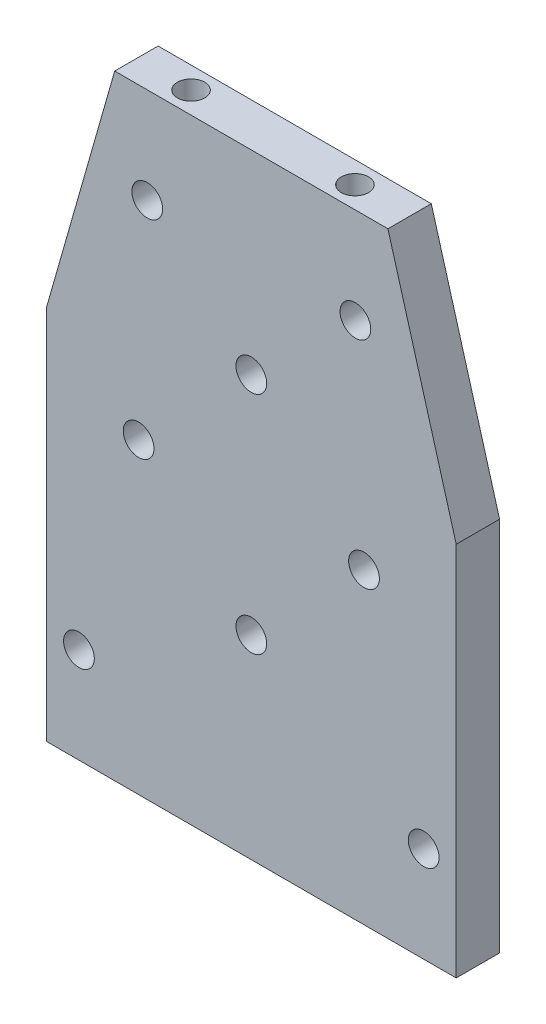
ISO-10303-21;
HEADER;
FILE_DESCRIPTION(('STEP AP214'),'2;1');
FILE_NAME('part.step','',(''),(''),'','','');
FILE_SCHEMA(('AUTOMOTIVE_DESIGN { 1 0 10303 214 1 1 1 1 }'));
ENDSEC;
DATA;
#1=APPLICATION_CONTEXT('core data for automotive mechanical design processes');
#2=APPLICATION_PROTOCOL_DEFINITION('international standard','automotive_design',2000,#1);
#3=PRODUCT_CONTEXT('',#1,'mechanical');
#4=PRODUCT('Part','Part','',(#3));
#5=PRODUCT_RELATED_PRODUCT_CATEGORY('part','',(#4));
#6=PRODUCT_DEFINITION_FORMATION('','',#4);
#7=PRODUCT_DEFINITION_CONTEXT('part definition',#1,'design');
#8=PRODUCT_DEFINITION('design','',#6,#7);
#9=PRODUCT_DEFINITION_SHAPE('','',#8);
#10=(LENGTH_UNIT() NAMED_UNIT(*) SI_UNIT(.MILLI.,.METRE.));
#11=(NAMED_UNIT(*) PLANE_ANGLE_UNIT() SI_UNIT($,.RADIAN.));
#12=(NAMED_UNIT(*) SI_UNIT($,.STERADIAN.) SOLID_ANGLE_UNIT());
#13=UNCERTAINTY_MEASURE_WITH_UNIT(LENGTH_MEASURE(1.E-05),#10,'distance_accuracy_value','');
#14=(GEOMETRIC_REPRESENTATION_CONTEXT(3) GLOBAL_UNCERTAINTY_ASSIGNED_CONTEXT((#13)) GLOBAL_UNIT_ASSIGNED_CONTEXT((#10,
#11,#12)) REPRESENTATION_CONTEXT('',''));
#15=CARTESIAN_POINT('',(0.,0.,0.));
#16=DIRECTION('',(0.,0.,1.));
#17=DIRECTION('',(1.,0.,0.));
#18=AXIS2_PLACEMENT_3D('',#15,#16,#17);
#19=CARTESIAN_POINT('',(-20.,45.,3.175));
#20=DIRECTION('',(0.961523947640823,-0.274721127897378,0.));
#21=DIRECTION('',(0.274721127897378,0.961523947640823,0.));
#22=AXIS2_PLACEMENT_3D('',#19,#20,#21);
#23=PLANE('',#22);
#24=DIRECTION('',(-0.274721127897378,-0.961523947640823,0.));
#25=VECTOR('',#24,1.);
#26=CARTESIAN_POINT('',(-20.,45.,-3.175));
#27=LINE('',#26,#25);
#28=CARTESIAN_POINT('',(-20.,45.,-3.175));
#29=VERTEX_POINT('',#28);
#30=CARTESIAN_POINT('',(-30.,9.99999999999999,-3.175));
#31=VERTEX_POINT('',#30);
#32=EDGE_CURVE('E116',#29,#31,#27,.T.);
#33=ORIENTED_EDGE('',*,*,#32,.T.);
#34=DIRECTION('',(0.,0.,-1.));
#35=VECTOR('',#34,1.);
#36=CARTESIAN_POINT('',(-30.,9.99999999999999,3.175));
#37=LINE('',#36,#35);
#38=CARTESIAN_POINT('',(-30.,9.99999999999999,3.175));
#39=VERTEX_POINT('',#38);
#40=EDGE_CURVE('E11',#39,#31,#37,.T.);
#41=ORIENTED_EDGE('',*,*,#40,.F.);
#42=DIRECTION('',(-0.274721127897378,-0.961523947640823,0.));
#43=VECTOR('',#42,1.);
#44=CARTESIAN_POINT('',(-20.,45.,3.175));
#45=LINE('',#44,#43);
#46=CARTESIAN_POINT('',(-20.,45.,3.175));
#47=VERTEX_POINT('',#46);
#48=EDGE_CURVE('E127',#47,#39,#45,.T.);
#49=ORIENTED_EDGE('',*,*,#48,.F.);
#50=DIRECTION('',(0.,0.,-1.));
#51=VECTOR('',#50,1.);
#52=CARTESIAN_POINT('',(-20.,45.,3.175));
#53=LINE('',#52,#51);
#54=EDGE_CURVE('E112',#47,#29,#53,.T.);
#55=ORIENTED_EDGE('',*,*,#54,.T.);
#56=EDGE_LOOP('',(#33,#41,#49,#55));
#57=FACE_BOUND('',#56,.T.);
#58=ADVANCED_FACE('F32',(#57),#23,.F.);
#59=CARTESIAN_POINT('',(-30.,9.99999999999999,3.175));
#60=DIRECTION('',(1.,0.,0.));
#61=DIRECTION('',(0.,1.,0.));
#62=AXIS2_PLACEMENT_3D('',#59,#60,#61);
#63=PLANE('',#62);
#64=DIRECTION('',(0.,-1.,0.));
#65=VECTOR('',#64,1.);
#66=CARTESIAN_POINT('',(-30.,9.99999999999999,-3.175));
#67=LINE('',#66,#65);
#68=CARTESIAN_POINT('',(-30.,-45.,-3.175));
#69=VERTEX_POINT('',#68);
#70=EDGE_CURVE('E119',#31,#69,#67,.T.);
#71=ORIENTED_EDGE('',*,*,#70,.T.);
#72=DIRECTION('',(0.,0.,-1.));
#73=VECTOR('',#72,1.);
#74=CARTESIAN_POINT('',(-30.,-45.,3.175));
#75=LINE('',#74,#73);
#76=CARTESIAN_POINT('',(-30.,-45.,3.175));
#77=VERTEX_POINT('',#76);
#78=EDGE_CURVE('E40',#77,#69,#75,.T.);
#79=ORIENTED_EDGE('',*,*,#78,.F.);
#80=DIRECTION('',(0.,-1.,0.));
#81=VECTOR('',#80,1.);
#82=CARTESIAN_POINT('',(-30.,9.99999999999999,3.175));
#83=LINE('',#82,#81);
#84=EDGE_CURVE('E85',#39,#77,#83,.T.);
#85=ORIENTED_EDGE('',*,*,#84,.F.);
#86=ORIENTED_EDGE('',*,*,#40,.T.);
#87=EDGE_LOOP('',(#71,#79,#85,#86));
#88=FACE_BOUND('',#87,.T.);
#89=ADVANCED_FACE('F155',(#88),#63,.F.);
#90=CARTESIAN_POINT('',(-30.,-45.,3.175));
#91=DIRECTION('',(0.,1.,0.));
#92=DIRECTION('',(-1.,0.,0.));
#93=AXIS2_PLACEMENT_3D('',#90,#91,#92);
#94=PLANE('',#93);
#95=CARTESIAN_POINT('',(20.,-45.,0.));
#96=DIRECTION('',(0.,-1.,0.));
#97=DIRECTION('',(1.,0.,0.));
#98=AXIS2_PLACEMENT_3D('',#95,#96,#97);
#99=CIRCLE('',#98,2.);
#100=CARTESIAN_POINT('',(22.,-45.,0.));
#101=VERTEX_POINT('',#100);
#102=EDGE_CURVE('E438',#101,#101,#99,.T.);
#103=ORIENTED_EDGE('',*,*,#102,.F.);
#104=EDGE_LOOP('',(#103));
#105=FACE_BOUND('',#104,.T.);
#106=CARTESIAN_POINT('',(-20.,-45.,0.));
#107=DIRECTION('',(0.,-1.,0.));
#108=DIRECTION('',(-1.,0.,0.));
#109=AXIS2_PLACEMENT_3D('',#106,#107,#108);
#110=CIRCLE('',#109,2.);
#111=CARTESIAN_POINT('',(-22.,-45.,0.));
#112=VERTEX_POINT('',#111);
#113=EDGE_CURVE('E444',#112,#112,#110,.T.);
#114=ORIENTED_EDGE('',*,*,#113,.F.);
#115=EDGE_LOOP('',(#114));
#116=FACE_BOUND('',#115,.T.);
#117=CARTESIAN_POINT('',(0.,-45.,0.));
#118=DIRECTION('',(0.,-1.,0.));
#119=DIRECTION('',(1.,0.,0.));
#120=AXIS2_PLACEMENT_3D('',#117,#118,#119);
#121=CIRCLE('',#120,2.);
#122=CARTESIAN_POINT('',(2.,-45.,0.));
#123=VERTEX_POINT('',#122);
#124=EDGE_CURVE('E417',#123,#123,#121,.T.);
#125=ORIENTED_EDGE('',*,*,#124,.F.);
#126=EDGE_LOOP('',(#125));
#127=FACE_BOUND('',#126,.T.);
#128=DIRECTION('',(1.,0.,0.));
#129=VECTOR('',#128,1.);
#130=CARTESIAN_POINT('',(-30.,-45.,-3.175));
#131=LINE('',#130,#129);
#132=CARTESIAN_POINT('',(30.,-45.,-3.175));
#133=VERTEX_POINT('',#132);
#134=EDGE_CURVE('E122',#69,#133,#131,.T.);
#135=ORIENTED_EDGE('',*,*,#134,.T.);
#136=DIRECTION('',(0.,0.,-1.));
#137=VECTOR('',#136,1.);
#138=CARTESIAN_POINT('',(30.,-45.,3.175));
#139=LINE('',#138,#137);
#140=CARTESIAN_POINT('',(30.,-45.,3.175));
#141=VERTEX_POINT('',#140);
#142=EDGE_CURVE('E107',#141,#133,#139,.T.);
#143=ORIENTED_EDGE('',*,*,#142,.F.);
#144=DIRECTION('',(1.,0.,0.));
#145=VECTOR('',#144,1.);
#146=CARTESIAN_POINT('',(-30.,-45.,3.175));
#147=LINE('',#146,#145);
#148=EDGE_CURVE('E98',#77,#141,#147,.T.);
#149=ORIENTED_EDGE('',*,*,#148,.F.);
#150=ORIENTED_EDGE('',*,*,#78,.T.);
#151=EDGE_LOOP('',(#135,#143,#149,#150));
#152=FACE_BOUND('',#151,.T.);
#153=ADVANCED_FACE('F133',(#105,#116,#127,#152),#94,.F.);
#154=CARTESIAN_POINT('',(30.,10.,3.175));
#155=DIRECTION('',(-1.,0.,0.));
#156=DIRECTION('',(0.,-1.,0.));
#157=AXIS2_PLACEMENT_3D('',#154,#155,#156);
#158=PLANE('',#157);
#159=DIRECTION('',(0.,1.,0.));
#160=VECTOR('',#159,1.);
#161=CARTESIAN_POINT('',(30.,10.,-3.175));
#162=LINE('',#161,#160);
#163=CARTESIAN_POINT('',(30.,10.,-3.175));
#164=VERTEX_POINT('',#163);
#165=EDGE_CURVE('E106',#133,#164,#162,.T.);
#166=ORIENTED_EDGE('',*,*,#165,.T.);
#167=DIRECTION('',(0.,0.,-1.));
#168=VECTOR('',#167,1.);
#169=CARTESIAN_POINT('',(30.,10.,3.175));
#170=LINE('',#169,#168);
#171=CARTESIAN_POINT('',(30.,10.,3.175));
#172=VERTEX_POINT('',#171);
#173=EDGE_CURVE('E103',#172,#164,#170,.T.);
#174=ORIENTED_EDGE('',*,*,#173,.F.);
#175=DIRECTION('',(0.,1.,0.));
#176=VECTOR('',#175,1.);
#177=CARTESIAN_POINT('',(30.,10.,3.175));
#178=LINE('',#177,#176);
#179=EDGE_CURVE('E92',#141,#172,#178,.T.);
#180=ORIENTED_EDGE('',*,*,#179,.F.);
#181=ORIENTED_EDGE('',*,*,#142,.T.);
#182=EDGE_LOOP('',(#166,#174,#180,#181));
#183=FACE_BOUND('',#182,.T.);
#184=ADVANCED_FACE('F104',(#183),#158,.F.);
#185=CARTESIAN_POINT('',(20.,45.,3.175));
#186=DIRECTION('',(-0.961523947640823,-0.274721127897379,0.));
#187=DIRECTION('',(0.274721127897379,-0.961523947640823,0.));
#188=AXIS2_PLACEMENT_3D('',#185,#186,#187);
#189=PLANE('',#188);
#190=DIRECTION('',(-0.274721127897379,0.961523947640823,0.));
#191=VECTOR('',#190,1.);
#192=CARTESIAN_POINT('',(20.,45.,-3.175));
#193=LINE('',#192,#191);
#194=CARTESIAN_POINT('',(20.,45.,-3.175));
#195=VERTEX_POINT('',#194);
#196=EDGE_CURVE('E71',#164,#195,#193,.T.);
#197=ORIENTED_EDGE('',*,*,#196,.T.);
#198=DIRECTION('',(0.,0.,-1.));
#199=VECTOR('',#198,1.);
#200=CARTESIAN_POINT('',(20.,45.,3.175));
#201=LINE('',#200,#199);
#202=CARTESIAN_POINT('',(20.,45.,3.175));
#203=VERTEX_POINT('',#202);
#204=EDGE_CURVE('E108',#203,#195,#201,.T.);
#205=ORIENTED_EDGE('',*,*,#204,.F.);
#206=DIRECTION('',(-0.274721127897379,0.961523947640823,0.));
#207=VECTOR('',#206,1.);
#208=CARTESIAN_POINT('',(20.,45.,3.175));
#209=LINE('',#208,#207);
#210=EDGE_CURVE('E96',#172,#203,#209,.T.);
#211=ORIENTED_EDGE('',*,*,#210,.F.);
#212=ORIENTED_EDGE('',*,*,#173,.T.);
#213=EDGE_LOOP('',(#197,#205,#211,#212));
#214=FACE_BOUND('',#213,.T.);
#215=ADVANCED_FACE('F110',(#214),#189,.F.);
#216=CARTESIAN_POINT('',(-20.,45.,3.175));
#217=DIRECTION('',(0.,-1.,0.));
#218=DIRECTION('',(1.,0.,0.));
#219=AXIS2_PLACEMENT_3D('',#216,#217,#218);
#220=PLANE('',#219);
#221=CARTESIAN_POINT('',(-12.,45.,0.));
#222=DIRECTION('',(0.,1.,0.));
#223=DIRECTION('',(-1.,0.,0.));
#224=AXIS2_PLACEMENT_3D('',#221,#222,#223);
#225=CIRCLE('',#224,2.);
#226=CARTESIAN_POINT('',(-14.,45.,0.));
#227=VERTEX_POINT('',#226);
#228=EDGE_CURVE('E454',#227,#227,#225,.T.);
#229=ORIENTED_EDGE('',*,*,#228,.F.);
#230=EDGE_LOOP('',(#229));
#231=FACE_BOUND('',#230,.T.);
#232=CARTESIAN_POINT('',(12.,45.,0.));
#233=DIRECTION('',(0.,1.,0.));
#234=DIRECTION('',(1.,0.,0.));
#235=AXIS2_PLACEMENT_3D('',#232,#233,#234);
#236=CIRCLE('',#235,2.);
#237=CARTESIAN_POINT('',(14.,45.,0.));
#238=VERTEX_POINT('',#237);
#239=EDGE_CURVE('E437',#238,#238,#236,.T.);
#240=ORIENTED_EDGE('',*,*,#239,.F.);
#241=EDGE_LOOP('',(#240));
#242=FACE_BOUND('',#241,.T.);
#243=DIRECTION('',(-1.,0.,0.));
#244=VECTOR('',#243,1.);
#245=CARTESIAN_POINT('',(-20.,45.,-3.175));
#246=LINE('',#245,#244);
#247=EDGE_CURVE('E77',#195,#29,#246,.T.);
#248=ORIENTED_EDGE('',*,*,#247,.T.);
#249=ORIENTED_EDGE('',*,*,#54,.F.);
#250=DIRECTION('',(-1.,0.,0.));
#251=VECTOR('',#250,1.);
#252=CARTESIAN_POINT('',(-20.,45.,3.175));
#253=LINE('',#252,#251);
#254=EDGE_CURVE('E48',#203,#47,#253,.T.);
#255=ORIENTED_EDGE('',*,*,#254,.F.);
#256=ORIENTED_EDGE('',*,*,#204,.T.);
#257=EDGE_LOOP('',(#248,#249,#255,#256));
#258=FACE_BOUND('',#257,.T.);
#259=ADVANCED_FACE('F140',(#231,#242,#258),#220,.F.);
#260=CARTESIAN_POINT('',(0.,0.,3.175));
#261=DIRECTION('',(0.,0.,1.));
#262=DIRECTION('',(1.,0.,0.));
#263=AXIS2_PLACEMENT_3D('',#260,#261,#262);
#264=PLANE('',#263);
#265=CARTESIAN_POINT('',(0.,16.5,3.175));
#266=DIRECTION('',(0.,0.,1.));
#267=DIRECTION('',(1.,0.,0.));
#268=AXIS2_PLACEMENT_3D('',#265,#266,#267);
#269=CIRCLE('',#268,2.25);
#270=CARTESIAN_POINT('',(2.25,16.5,3.175));
#271=VERTEX_POINT('',#270);
#272=EDGE_CURVE('E384',#271,#271,#269,.T.);
#273=ORIENTED_EDGE('',*,*,#272,.F.);
#274=EDGE_LOOP('',(#273));
#275=FACE_BOUND('',#274,.T.);
#276=CARTESIAN_POINT('',(-16.5000000000005,4.65927204773777E-13,3.175));
#277=DIRECTION('',(0.,0.,1.));
#278=DIRECTION('',(1.,0.,0.));
#279=AXIS2_PLACEMENT_3D('',#276,#277,#278);
#280=CIRCLE('',#279,2.25);
#281=CARTESIAN_POINT('',(-14.2500000000005,4.65927204773777E-13,3.175));
#282=VERTEX_POINT('',#281);
#283=EDGE_CURVE('E405',#282,#282,#280,.T.);
#284=ORIENTED_EDGE('',*,*,#283,.F.);
#285=EDGE_LOOP('',(#284));
#286=FACE_BOUND('',#285,.T.);
#287=CARTESIAN_POINT('',(-9.31854409547553E-13,-16.5,3.175));
#288=DIRECTION('',(0.,0.,1.));
#289=DIRECTION('',(1.,0.,0.));
#290=AXIS2_PLACEMENT_3D('',#287,#288,#289);
#291=CIRCLE('',#290,2.25);
#292=CARTESIAN_POINT('',(2.24999999999907,-16.5,3.175));
#293=VERTEX_POINT('',#292);
#294=EDGE_CURVE('E392',#293,#293,#291,.T.);
#295=ORIENTED_EDGE('',*,*,#294,.F.);
#296=EDGE_LOOP('',(#295));
#297=FACE_BOUND('',#296,.T.);
#298=CARTESIAN_POINT('',(16.4999999999995,-4.6794787199237E-13,3.175));
#299=DIRECTION('',(0.,0.,1.));
#300=DIRECTION('',(1.,0.,0.));
#301=AXIS2_PLACEMENT_3D('',#298,#299,#300);
#302=CIRCLE('',#301,2.25);
#303=CARTESIAN_POINT('',(18.7499999999995,-4.6794787199237E-13,3.175));
#304=VERTEX_POINT('',#303);
#305=EDGE_CURVE('E388',#304,#304,#302,.T.);
#306=ORIENTED_EDGE('',*,*,#305,.F.);
#307=EDGE_LOOP('',(#306));
#308=FACE_BOUND('',#307,.T.);
#309=CARTESIAN_POINT('',(-25.2375,-31.,3.175));
#310=DIRECTION('',(0.,0.,1.));
#311=DIRECTION('',(1.,0.,0.));
#312=AXIS2_PLACEMENT_3D('',#309,#310,#311);
#313=CIRCLE('',#312,2.25);
#314=CARTESIAN_POINT('',(-22.9875,-31.,3.175));
#315=VERTEX_POINT('',#314);
#316=EDGE_CURVE('E410',#315,#315,#313,.T.);
#317=ORIENTED_EDGE('',*,*,#316,.F.);
#318=EDGE_LOOP('',(#317));
#319=FACE_BOUND('',#318,.T.);
#320=CARTESIAN_POINT('',(15.2374999999996,31.,3.175));
#321=DIRECTION('',(0.,0.,1.));
#322=DIRECTION('',(-1.,0.,0.));
#323=AXIS2_PLACEMENT_3D('',#320,#321,#322);
#324=CIRCLE('',#323,2.25);
#325=CARTESIAN_POINT('',(12.9874999999996,31.,3.175));
#326=VERTEX_POINT('',#325);
#327=EDGE_CURVE('E409',#326,#326,#324,.T.);
#328=ORIENTED_EDGE('',*,*,#327,.F.);
#329=EDGE_LOOP('',(#328));
#330=FACE_BOUND('',#329,.T.);
#331=CARTESIAN_POINT('',(-15.2374999999996,31.,3.175));
#332=DIRECTION('',(0.,0.,1.));
#333=DIRECTION('',(1.,0.,0.));
#334=AXIS2_PLACEMENT_3D('',#331,#332,#333);
#335=CIRCLE('',#334,2.25);
#336=CARTESIAN_POINT('',(-12.9874999999996,31.,3.175));
#337=VERTEX_POINT('',#336);
#338=EDGE_CURVE('E423',#337,#337,#335,.T.);
#339=ORIENTED_EDGE('',*,*,#338,.F.);
#340=EDGE_LOOP('',(#339));
#341=FACE_BOUND('',#340,.T.);
#342=CARTESIAN_POINT('',(25.2375,-31.,3.175));
#343=DIRECTION('',(0.,0.,1.));
#344=DIRECTION('',(-1.,0.,0.));
#345=AXIS2_PLACEMENT_3D('',#342,#343,#344);
#346=CIRCLE('',#345,2.25);
#347=CARTESIAN_POINT('',(22.9875,-31.,3.175));
#348=VERTEX_POINT('',#347);
#349=EDGE_CURVE('E424',#348,#348,#346,.T.);
#350=ORIENTED_EDGE('',*,*,#349,.F.);
#351=EDGE_LOOP('',(#350));
#352=FACE_BOUND('',#351,.T.);
#353=ORIENTED_EDGE('',*,*,#48,.T.);
#354=ORIENTED_EDGE('',*,*,#84,.T.);
#355=ORIENTED_EDGE('',*,*,#148,.T.);
#356=ORIENTED_EDGE('',*,*,#179,.T.);
#357=ORIENTED_EDGE('',*,*,#210,.T.);
#358=ORIENTED_EDGE('',*,*,#254,.T.);
#359=EDGE_LOOP('',(#353,#354,#355,#356,#357,#358));
#360=FACE_BOUND('',#359,.T.);
#361=ADVANCED_FACE('F94',(#275,#286,#297,#308,#319,#330,#341,#352,#360),#264,.T.);
#362=CARTESIAN_POINT('',(0.,0.,-3.175));
#363=DIRECTION('',(0.,0.,1.));
#364=DIRECTION('',(1.,0.,0.));
#365=AXIS2_PLACEMENT_3D('',#362,#363,#364);
#366=PLANE('',#365);
#367=CARTESIAN_POINT('',(0.,16.5,-3.175));
#368=DIRECTION('',(0.,0.,-1.));
#369=DIRECTION('',(-1.,0.,0.));
#370=AXIS2_PLACEMENT_3D('',#367,#368,#369);
#371=CIRCLE('',#370,2.25);
#372=CARTESIAN_POINT('',(-2.25,16.5,-3.175));
#373=VERTEX_POINT('',#372);
#374=EDGE_CURVE('E387',#373,#373,#371,.T.);
#375=ORIENTED_EDGE('',*,*,#374,.F.);
#376=EDGE_LOOP('',(#375));
#377=FACE_BOUND('',#376,.T.);
#378=CARTESIAN_POINT('',(-16.5000000000005,4.65927204773777E-13,-3.175));
#379=DIRECTION('',(0.,0.,-1.));
#380=DIRECTION('',(-1.,0.,0.));
#381=AXIS2_PLACEMENT_3D('',#378,#379,#380);
#382=CIRCLE('',#381,2.25);
#383=CARTESIAN_POINT('',(-18.7500000000005,4.65927204773777E-13,-3.175));
#384=VERTEX_POINT('',#383);
#385=EDGE_CURVE('E389',#384,#384,#382,.T.);
#386=ORIENTED_EDGE('',*,*,#385,.F.);
#387=EDGE_LOOP('',(#386));
#388=FACE_BOUND('',#387,.T.);
#389=CARTESIAN_POINT('',(-9.31854409547553E-13,-16.5,-3.175));
#390=DIRECTION('',(0.,0.,-1.));
#391=DIRECTION('',(-1.,0.,0.));
#392=AXIS2_PLACEMENT_3D('',#389,#390,#391);
#393=CIRCLE('',#392,2.25);
#394=CARTESIAN_POINT('',(-2.25000000000093,-16.5,-3.175));
#395=VERTEX_POINT('',#394);
#396=EDGE_CURVE('E395',#395,#395,#393,.T.);
#397=ORIENTED_EDGE('',*,*,#396,.F.);
#398=EDGE_LOOP('',(#397));
#399=FACE_BOUND('',#398,.T.);
#400=CARTESIAN_POINT('',(16.4999999999995,-4.6794787199237E-13,-3.175));
#401=DIRECTION('',(0.,0.,-1.));
#402=DIRECTION('',(-1.,0.,0.));
#403=AXIS2_PLACEMENT_3D('',#400,#401,#402);
#404=CIRCLE('',#403,2.25);
#405=CARTESIAN_POINT('',(14.2499999999995,-4.6794787199237E-13,-3.175));
#406=VERTEX_POINT('',#405);
#407=EDGE_CURVE('E400',#406,#406,#404,.T.);
#408=ORIENTED_EDGE('',*,*,#407,.F.);
#409=EDGE_LOOP('',(#408));
#410=FACE_BOUND('',#409,.T.);
#411=CARTESIAN_POINT('',(-25.2375,-31.,-3.175));
#412=DIRECTION('',(0.,0.,1.));
#413=DIRECTION('',(1.,0.,0.));
#414=AXIS2_PLACEMENT_3D('',#411,#412,#413);
#415=CIRCLE('',#414,2.25);
#416=CARTESIAN_POINT('',(-22.9875,-31.,-3.175));
#417=VERTEX_POINT('',#416);
#418=EDGE_CURVE('E413',#417,#417,#415,.F.);
#419=ORIENTED_EDGE('',*,*,#418,.F.);
#420=EDGE_LOOP('',(#419));
#421=FACE_BOUND('',#420,.T.);
#422=CARTESIAN_POINT('',(15.2374999999996,31.,-3.175));
#423=DIRECTION('',(0.,0.,1.));
#424=DIRECTION('',(1.,0.,0.));
#425=AXIS2_PLACEMENT_3D('',#422,#423,#424);
#426=CIRCLE('',#425,2.25);
#427=CARTESIAN_POINT('',(17.4874999999996,31.,-3.175));
#428=VERTEX_POINT('',#427);
#429=EDGE_CURVE('E420',#428,#428,#426,.F.);
#430=ORIENTED_EDGE('',*,*,#429,.F.);
#431=EDGE_LOOP('',(#430));
#432=FACE_BOUND('',#431,.T.);
#433=CARTESIAN_POINT('',(-15.2374999999996,31.,-3.175));
#434=DIRECTION('',(0.,0.,1.));
#435=DIRECTION('',(1.,0.,0.));
#436=AXIS2_PLACEMENT_3D('',#433,#434,#435);
#437=CIRCLE('',#436,2.25);
#438=CARTESIAN_POINT('',(-12.9874999999996,31.,-3.175));
#439=VERTEX_POINT('',#438);
#440=EDGE_CURVE('E427',#439,#439,#437,.F.);
#441=ORIENTED_EDGE('',*,*,#440,.F.);
#442=EDGE_LOOP('',(#441));
#443=FACE_BOUND('',#442,.T.);
#444=CARTESIAN_POINT('',(25.2375,-31.,-3.175));
#445=DIRECTION('',(0.,0.,1.));
#446=DIRECTION('',(1.,0.,0.));
#447=AXIS2_PLACEMENT_3D('',#444,#445,#446);
#448=CIRCLE('',#447,2.25);
#449=CARTESIAN_POINT('',(27.4875,-31.,-3.175));
#450=VERTEX_POINT('',#449);
#451=EDGE_CURVE('E414',#450,#450,#448,.F.);
#452=ORIENTED_EDGE('',*,*,#451,.F.);
#453=EDGE_LOOP('',(#452));
#454=FACE_BOUND('',#453,.T.);
#455=ORIENTED_EDGE('',*,*,#32,.F.);
#456=ORIENTED_EDGE('',*,*,#247,.F.);
#457=ORIENTED_EDGE('',*,*,#196,.F.);
#458=ORIENTED_EDGE('',*,*,#165,.F.);
#459=ORIENTED_EDGE('',*,*,#134,.F.);
#460=ORIENTED_EDGE('',*,*,#70,.F.);
#461=EDGE_LOOP('',(#455,#456,#457,#458,#459,#460));
#462=FACE_BOUND('',#461,.T.);
#463=ADVANCED_FACE('F136',(#377,#388,#399,#410,#421,#432,#443,#454,#462),#366,.F.);
#464=CARTESIAN_POINT('',(12.,37.,0.));
#465=DIRECTION('',(0.,1.,0.));
#466=DIRECTION('',(-1.,0.,0.));
#467=AXIS2_PLACEMENT_3D('',#464,#465,#466);
#468=CYLINDRICAL_SURFACE('',#467,2.);
#469=CARTESIAN_POINT('',(12.,37.,0.));
#470=DIRECTION('',(0.,1.,0.));
#471=DIRECTION('',(1.,0.,0.));
#472=AXIS2_PLACEMENT_3D('',#469,#470,#471);
#473=CIRCLE('',#472,2.);
#474=CARTESIAN_POINT('',(14.,37.,0.));
#475=VERTEX_POINT('',#474);
#476=EDGE_CURVE('E457',#475,#475,#473,.T.);
#477=ORIENTED_EDGE('',*,*,#476,.F.);
#478=EDGE_LOOP('',(#477));
#479=FACE_BOUND('',#478,.T.);
#480=ORIENTED_EDGE('',*,*,#239,.T.);
#481=EDGE_LOOP('',(#480));
#482=FACE_BOUND('',#481,.T.);
#483=ADVANCED_FACE('F184',(#479,#482),#468,.F.);
#484=CARTESIAN_POINT('',(12.,37.,0.));
#485=DIRECTION('',(0.,-1.,0.));
#486=DIRECTION('',(1.,0.,0.));
#487=AXIS2_PLACEMENT_3D('',#484,#485,#486);
#488=PLANE('',#487);
#489=ORIENTED_EDGE('',*,*,#476,.T.);
#490=EDGE_LOOP('',(#489));
#491=FACE_BOUND('',#490,.T.);
#492=ADVANCED_FACE('F189',(#491),#488,.F.);
#493=CARTESIAN_POINT('',(-12.,37.,0.));
#494=DIRECTION('',(0.,1.,0.));
#495=DIRECTION('',(-1.,0.,0.));
#496=AXIS2_PLACEMENT_3D('',#493,#494,#495);
#497=CYLINDRICAL_SURFACE('',#496,2.);
#498=CARTESIAN_POINT('',(-12.,37.,0.));
#499=DIRECTION('',(0.,1.,0.));
#500=DIRECTION('',(-1.,0.,0.));
#501=AXIS2_PLACEMENT_3D('',#498,#499,#500);
#502=CIRCLE('',#501,2.);
#503=CARTESIAN_POINT('',(-14.,37.,0.));
#504=VERTEX_POINT('',#503);
#505=EDGE_CURVE('E120',#504,#504,#502,.T.);
#506=ORIENTED_EDGE('',*,*,#505,.F.);
#507=EDGE_LOOP('',(#506));
#508=FACE_BOUND('',#507,.T.);
#509=ORIENTED_EDGE('',*,*,#228,.T.);
#510=EDGE_LOOP('',(#509));
#511=FACE_BOUND('',#510,.T.);
#512=ADVANCED_FACE('F201',(#508,#511),#497,.F.);
#513=CARTESIAN_POINT('',(-12.,37.,0.));
#514=DIRECTION('',(0.,1.,0.));
#515=DIRECTION('',(-1.,0.,0.));
#516=AXIS2_PLACEMENT_3D('',#513,#514,#515);
#517=PLANE('',#516);
#518=ORIENTED_EDGE('',*,*,#505,.T.);
#519=EDGE_LOOP('',(#518));
#520=FACE_BOUND('',#519,.T.);
#521=ADVANCED_FACE('F211',(#520),#517,.T.);
#522=CARTESIAN_POINT('',(0.,-37.,0.));
#523=DIRECTION('',(0.,-1.,0.));
#524=DIRECTION('',(1.,0.,0.));
#525=AXIS2_PLACEMENT_3D('',#522,#523,#524);
#526=CYLINDRICAL_SURFACE('',#525,2.);
#527=CARTESIAN_POINT('',(0.,-37.,0.));
#528=DIRECTION('',(0.,-1.,0.));
#529=DIRECTION('',(1.,0.,0.));
#530=AXIS2_PLACEMENT_3D('',#527,#528,#529);
#531=CIRCLE('',#530,2.);
#532=CARTESIAN_POINT('',(2.,-37.,0.));
#533=VERTEX_POINT('',#532);
#534=EDGE_CURVE('E447',#533,#533,#531,.T.);
#535=ORIENTED_EDGE('',*,*,#534,.F.);
#536=EDGE_LOOP('',(#535));
#537=FACE_BOUND('',#536,.T.);
#538=ORIENTED_EDGE('',*,*,#124,.T.);
#539=EDGE_LOOP('',(#538));
#540=FACE_BOUND('',#539,.T.);
#541=ADVANCED_FACE('F220',(#537,#540),#526,.F.);
#542=CARTESIAN_POINT('',(0.,-37.,0.));
#543=DIRECTION('',(0.,-1.,0.));
#544=DIRECTION('',(1.,0.,0.));
#545=AXIS2_PLACEMENT_3D('',#542,#543,#544);
#546=PLANE('',#545);
#547=ORIENTED_EDGE('',*,*,#534,.T.);
#548=EDGE_LOOP('',(#547));
#549=FACE_BOUND('',#548,.T.);
#550=ADVANCED_FACE('F236',(#549),#546,.T.);
#551=CARTESIAN_POINT('',(-20.,-37.,0.));
#552=DIRECTION('',(0.,-1.,0.));
#553=DIRECTION('',(1.,0.,0.));
#554=AXIS2_PLACEMENT_3D('',#551,#552,#553);
#555=CYLINDRICAL_SURFACE('',#554,2.);
#556=CARTESIAN_POINT('',(-20.,-37.,0.));
#557=DIRECTION('',(0.,-1.,0.));
#558=DIRECTION('',(-1.,0.,0.));
#559=AXIS2_PLACEMENT_3D('',#556,#557,#558);
#560=CIRCLE('',#559,2.);
#561=CARTESIAN_POINT('',(-22.,-37.,0.));
#562=VERTEX_POINT('',#561);
#563=EDGE_CURVE('E441',#562,#562,#560,.T.);
#564=ORIENTED_EDGE('',*,*,#563,.F.);
#565=EDGE_LOOP('',(#564));
#566=FACE_BOUND('',#565,.T.);
#567=ORIENTED_EDGE('',*,*,#113,.T.);
#568=EDGE_LOOP('',(#567));
#569=FACE_BOUND('',#568,.T.);
#570=ADVANCED_FACE('F246',(#566,#569),#555,.F.);
#571=CARTESIAN_POINT('',(-20.,-37.,0.));
#572=DIRECTION('',(0.,1.,0.));
#573=DIRECTION('',(-1.,0.,0.));
#574=AXIS2_PLACEMENT_3D('',#571,#572,#573);
#575=PLANE('',#574);
#576=ORIENTED_EDGE('',*,*,#563,.T.);
#577=EDGE_LOOP('',(#576));
#578=FACE_BOUND('',#577,.T.);
#579=ADVANCED_FACE('F256',(#578),#575,.F.);
#580=CARTESIAN_POINT('',(20.,-37.,0.));
#581=DIRECTION('',(0.,-1.,0.));
#582=DIRECTION('',(1.,0.,0.));
#583=AXIS2_PLACEMENT_3D('',#580,#581,#582);
#584=CYLINDRICAL_SURFACE('',#583,2.);
#585=CARTESIAN_POINT('',(20.,-37.,0.));
#586=DIRECTION('',(0.,-1.,0.));
#587=DIRECTION('',(1.,0.,0.));
#588=AXIS2_PLACEMENT_3D('',#585,#586,#587);
#589=CIRCLE('',#588,2.);
#590=CARTESIAN_POINT('',(22.,-37.,0.));
#591=VERTEX_POINT('',#590);
#592=EDGE_CURVE('E434',#591,#591,#589,.T.);
#593=ORIENTED_EDGE('',*,*,#592,.F.);
#594=EDGE_LOOP('',(#593));
#595=FACE_BOUND('',#594,.T.);
#596=ORIENTED_EDGE('',*,*,#102,.T.);
#597=EDGE_LOOP('',(#596));
#598=FACE_BOUND('',#597,.T.);
#599=ADVANCED_FACE('F266',(#595,#598),#584,.F.);
#600=CARTESIAN_POINT('',(20.,-37.,0.));
#601=DIRECTION('',(0.,-1.,0.));
#602=DIRECTION('',(1.,0.,0.));
#603=AXIS2_PLACEMENT_3D('',#600,#601,#602);
#604=PLANE('',#603);
#605=ORIENTED_EDGE('',*,*,#592,.T.);
#606=EDGE_LOOP('',(#605));
#607=FACE_BOUND('',#606,.T.);
#608=ADVANCED_FACE('F276',(#607),#604,.T.);
#609=CARTESIAN_POINT('',(25.2375,-31.,-9.53896103067893));
#610=DIRECTION('',(0.,0.,1.));
#611=DIRECTION('',(1.,0.,0.));
#612=AXIS2_PLACEMENT_3D('',#609,#610,#611);
#613=CYLINDRICAL_SURFACE('',#612,2.25);
#614=ORIENTED_EDGE('',*,*,#451,.T.);
#615=EDGE_LOOP('',(#614));
#616=FACE_BOUND('',#615,.T.);
#617=ORIENTED_EDGE('',*,*,#349,.T.);
#618=EDGE_LOOP('',(#617));
#619=FACE_BOUND('',#618,.T.);
#620=ADVANCED_FACE('F286',(#616,#619),#613,.F.);
#621=CARTESIAN_POINT('',(-15.2374999999996,31.,-9.53896103067893));
#622=DIRECTION('',(0.,0.,1.));
#623=DIRECTION('',(1.,0.,0.));
#624=AXIS2_PLACEMENT_3D('',#621,#622,#623);
#625=CYLINDRICAL_SURFACE('',#624,2.25);
#626=ORIENTED_EDGE('',*,*,#440,.T.);
#627=EDGE_LOOP('',(#626));
#628=FACE_BOUND('',#627,.T.);
#629=ORIENTED_EDGE('',*,*,#338,.T.);
#630=EDGE_LOOP('',(#629));
#631=FACE_BOUND('',#630,.T.);
#632=ADVANCED_FACE('F296',(#628,#631),#625,.F.);
#633=CARTESIAN_POINT('',(15.2374999999996,31.,-9.53896103067893));
#634=DIRECTION('',(0.,0.,1.));
#635=DIRECTION('',(1.,0.,0.));
#636=AXIS2_PLACEMENT_3D('',#633,#634,#635);
#637=CYLINDRICAL_SURFACE('',#636,2.25);
#638=ORIENTED_EDGE('',*,*,#429,.T.);
#639=EDGE_LOOP('',(#638));
#640=FACE_BOUND('',#639,.T.);
#641=ORIENTED_EDGE('',*,*,#327,.T.);
#642=EDGE_LOOP('',(#641));
#643=FACE_BOUND('',#642,.T.);
#644=ADVANCED_FACE('F306',(#640,#643),#637,.F.);
#645=CARTESIAN_POINT('',(-25.2375,-31.,-9.53896103067893));
#646=DIRECTION('',(0.,0.,1.));
#647=DIRECTION('',(1.,0.,0.));
#648=AXIS2_PLACEMENT_3D('',#645,#646,#647);
#649=CYLINDRICAL_SURFACE('',#648,2.25);
#650=ORIENTED_EDGE('',*,*,#418,.T.);
#651=EDGE_LOOP('',(#650));
#652=FACE_BOUND('',#651,.T.);
#653=ORIENTED_EDGE('',*,*,#316,.T.);
#654=EDGE_LOOP('',(#653));
#655=FACE_BOUND('',#654,.T.);
#656=ADVANCED_FACE('F316',(#652,#655),#649,.F.);
#657=CARTESIAN_POINT('',(16.4999999999995,-4.6794787199237E-13,6.825));
#658=DIRECTION('',(0.,0.,-1.));
#659=DIRECTION('',(-1.,0.,0.));
#660=AXIS2_PLACEMENT_3D('',#657,#658,#659);
#661=CYLINDRICAL_SURFACE('',#660,2.25);
#662=ORIENTED_EDGE('',*,*,#305,.T.);
#663=EDGE_LOOP('',(#662));
#664=FACE_BOUND('',#663,.T.);
#665=ORIENTED_EDGE('',*,*,#407,.T.);
#666=EDGE_LOOP('',(#665));
#667=FACE_BOUND('',#666,.T.);
#668=ADVANCED_FACE('F326',(#664,#667),#661,.F.);
#669=CARTESIAN_POINT('',(-9.31854409547553E-13,-16.5,6.825));
#670=DIRECTION('',(0.,0.,-1.));
#671=DIRECTION('',(-1.,0.,0.));
#672=AXIS2_PLACEMENT_3D('',#669,#670,#671);
#673=CYLINDRICAL_SURFACE('',#672,2.25);
#674=ORIENTED_EDGE('',*,*,#294,.T.);
#675=EDGE_LOOP('',(#674));
#676=FACE_BOUND('',#675,.T.);
#677=ORIENTED_EDGE('',*,*,#396,.T.);
#678=EDGE_LOOP('',(#677));
#679=FACE_BOUND('',#678,.T.);
#680=ADVANCED_FACE('F347',(#676,#679),#673,.F.);
#681=CARTESIAN_POINT('',(-16.5000000000005,4.65927204773777E-13,6.825));
#682=DIRECTION('',(0.,0.,-1.));
#683=DIRECTION('',(-1.,0.,0.));
#684=AXIS2_PLACEMENT_3D('',#681,#682,#683);
#685=CYLINDRICAL_SURFACE('',#684,2.25);
#686=ORIENTED_EDGE('',*,*,#283,.T.);
#687=EDGE_LOOP('',(#686));
#688=FACE_BOUND('',#687,.T.);
#689=ORIENTED_EDGE('',*,*,#385,.T.);
#690=EDGE_LOOP('',(#689));
#691=FACE_BOUND('',#690,.T.);
#692=ADVANCED_FACE('F357',(#688,#691),#685,.F.);
#693=CARTESIAN_POINT('',(0.,16.5,6.825));
#694=DIRECTION('',(0.,0.,-1.));
#695=DIRECTION('',(-1.,0.,0.));
#696=AXIS2_PLACEMENT_3D('',#693,#694,#695);
#697=CYLINDRICAL_SURFACE('',#696,2.25);
#698=ORIENTED_EDGE('',*,*,#272,.T.);
#699=EDGE_LOOP('',(#698));
#700=FACE_BOUND('',#699,.T.);
#701=ORIENTED_EDGE('',*,*,#374,.T.);
#702=EDGE_LOOP('',(#701));
#703=FACE_BOUND('',#702,.T.);
#704=ADVANCED_FACE('F367',(#700,#703),#697,.F.);
#705=CLOSED_SHELL('',(#58,#89,#153,#184,#215,#259,#361,#463,#483,#492,#512,#521,#541,#550,#570,
#579,#599,#608,#620,#632,#644,#656,#668,#680,#692,#704));
#706=MANIFOLD_SOLID_BREP('B2',#705);
#707=ADVANCED_BREP_SHAPE_REPRESENTATION('',(#18,#706),#14);
#708=SHAPE_DEFINITION_REPRESENTATION(#9,#707);
ENDSEC;
END-ISO-10303-21;
